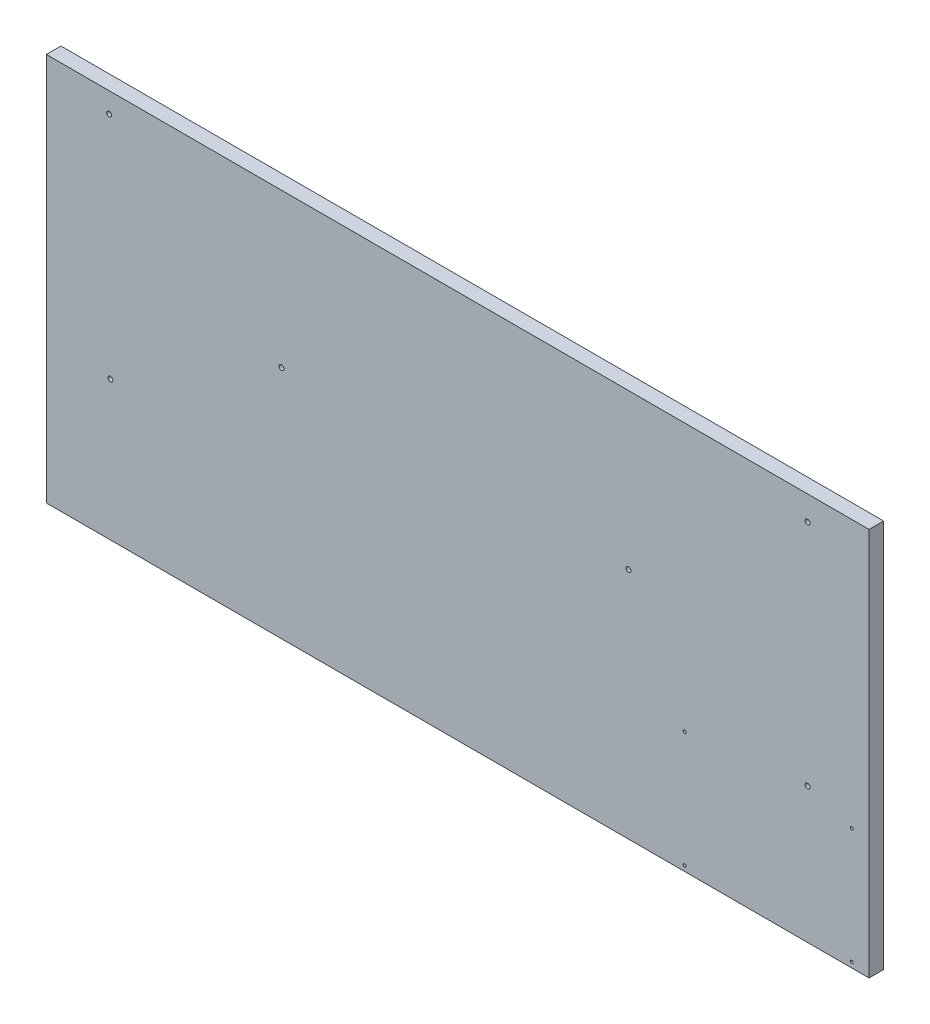
ISO-10303-21;
HEADER;
FILE_DESCRIPTION(('STEP AP214'),'2;1');
FILE_NAME('part.step','',(''),(''),'','','');
FILE_SCHEMA(('AUTOMOTIVE_DESIGN { 1 0 10303 214 1 1 1 1 }'));
ENDSEC;
DATA;
#1=APPLICATION_CONTEXT('core data for automotive mechanical design processes');
#2=APPLICATION_PROTOCOL_DEFINITION('international standard','automotive_design',2000,#1);
#3=PRODUCT_CONTEXT('',#1,'mechanical');
#4=PRODUCT('Part','Part','',(#3));
#5=PRODUCT_RELATED_PRODUCT_CATEGORY('part','',(#4));
#6=PRODUCT_DEFINITION_FORMATION('','',#4);
#7=PRODUCT_DEFINITION_CONTEXT('part definition',#1,'design');
#8=PRODUCT_DEFINITION('design','',#6,#7);
#9=PRODUCT_DEFINITION_SHAPE('','',#8);
#10=(LENGTH_UNIT() NAMED_UNIT(*) SI_UNIT(.MILLI.,.METRE.));
#11=(NAMED_UNIT(*) PLANE_ANGLE_UNIT() SI_UNIT($,.RADIAN.));
#12=(NAMED_UNIT(*) SI_UNIT($,.STERADIAN.) SOLID_ANGLE_UNIT());
#13=UNCERTAINTY_MEASURE_WITH_UNIT(LENGTH_MEASURE(1.E-05),#10,'distance_accuracy_value','');
#14=(GEOMETRIC_REPRESENTATION_CONTEXT(3) GLOBAL_UNCERTAINTY_ASSIGNED_CONTEXT((#13)) GLOBAL_UNIT_ASSIGNED_CONTEXT((#10,
#11,#12)) REPRESENTATION_CONTEXT('',''));
#15=CARTESIAN_POINT('',(0.,0.,0.));
#16=DIRECTION('',(0.,0.,1.));
#17=DIRECTION('',(1.,0.,0.));
#18=AXIS2_PLACEMENT_3D('',#15,#16,#17);
#19=CARTESIAN_POINT('',(-422.5,-199.5,15.));
#20=DIRECTION('',(1.,0.,0.));
#21=DIRECTION('',(0.,0.,-1.));
#22=AXIS2_PLACEMENT_3D('',#19,#20,#21);
#23=PLANE('',#22);
#24=DIRECTION('',(0.,-1.,0.));
#25=VECTOR('',#24,1.);
#26=CARTESIAN_POINT('',(-422.5,-199.5,0.));
#27=LINE('',#26,#25);
#28=CARTESIAN_POINT('',(-422.5,199.5,0.));
#29=VERTEX_POINT('',#28);
#30=CARTESIAN_POINT('',(-422.5,-199.5,0.));
#31=VERTEX_POINT('',#30);
#32=EDGE_CURVE('E112',#29,#31,#27,.T.);
#33=ORIENTED_EDGE('',*,*,#32,.T.);
#34=DIRECTION('',(0.,0.,-1.));
#35=VECTOR('',#34,1.);
#36=CARTESIAN_POINT('',(-422.5,-199.5,15.));
#37=LINE('',#36,#35);
#38=CARTESIAN_POINT('',(-422.5,-199.5,15.));
#39=VERTEX_POINT('',#38);
#40=EDGE_CURVE('E11',#39,#31,#37,.T.);
#41=ORIENTED_EDGE('',*,*,#40,.F.);
#42=DIRECTION('',(0.,-1.,0.));
#43=VECTOR('',#42,1.);
#44=CARTESIAN_POINT('',(-422.5,-199.5,15.));
#45=LINE('',#44,#43);
#46=CARTESIAN_POINT('',(-422.5,199.5,15.));
#47=VERTEX_POINT('',#46);
#48=EDGE_CURVE('E96',#47,#39,#45,.T.);
#49=ORIENTED_EDGE('',*,*,#48,.F.);
#50=DIRECTION('',(0.,0.,-1.));
#51=VECTOR('',#50,1.);
#52=CARTESIAN_POINT('',(-422.5,199.5,15.));
#53=LINE('',#52,#51);
#54=EDGE_CURVE('E108',#47,#29,#53,.T.);
#55=ORIENTED_EDGE('',*,*,#54,.T.);
#56=EDGE_LOOP('',(#33,#41,#49,#55));
#57=FACE_BOUND('',#56,.T.);
#58=ADVANCED_FACE('F44',(#57),#23,.F.);
#59=CARTESIAN_POINT('',(422.5,-199.5,15.));
#60=DIRECTION('',(0.,1.,0.));
#61=DIRECTION('',(-1.,0.,0.));
#62=AXIS2_PLACEMENT_3D('',#59,#60,#61);
#63=PLANE('',#62);
#64=DIRECTION('',(1.,0.,0.));
#65=VECTOR('',#64,1.);
#66=CARTESIAN_POINT('',(422.5,-199.5,0.));
#67=LINE('',#66,#65);
#68=CARTESIAN_POINT('',(422.5,-199.5,0.));
#69=VERTEX_POINT('',#68);
#70=EDGE_CURVE('E101',#31,#69,#67,.T.);
#71=ORIENTED_EDGE('',*,*,#70,.T.);
#72=DIRECTION('',(0.,0.,-1.));
#73=VECTOR('',#72,1.);
#74=CARTESIAN_POINT('',(422.5,-199.5,15.));
#75=LINE('',#74,#73);
#76=CARTESIAN_POINT('',(422.5,-199.5,15.));
#77=VERTEX_POINT('',#76);
#78=EDGE_CURVE('E53',#77,#69,#75,.T.);
#79=ORIENTED_EDGE('',*,*,#78,.F.);
#80=DIRECTION('',(1.,0.,0.));
#81=VECTOR('',#80,1.);
#82=CARTESIAN_POINT('',(422.5,-199.5,15.));
#83=LINE('',#82,#81);
#84=EDGE_CURVE('E91',#39,#77,#83,.T.);
#85=ORIENTED_EDGE('',*,*,#84,.F.);
#86=ORIENTED_EDGE('',*,*,#40,.T.);
#87=EDGE_LOOP('',(#71,#79,#85,#86));
#88=FACE_BOUND('',#87,.T.);
#89=ADVANCED_FACE('F100',(#88),#63,.F.);
#90=CARTESIAN_POINT('',(422.5,-199.5,15.));
#91=DIRECTION('',(-1.,0.,0.));
#92=DIRECTION('',(0.,0.,1.));
#93=AXIS2_PLACEMENT_3D('',#90,#91,#92);
#94=PLANE('',#93);
#95=DIRECTION('',(0.,1.,0.));
#96=VECTOR('',#95,1.);
#97=CARTESIAN_POINT('',(422.5,-199.5,0.));
#98=LINE('',#97,#96);
#99=CARTESIAN_POINT('',(422.5,199.5,0.));
#100=VERTEX_POINT('',#99);
#101=EDGE_CURVE('E78',#69,#100,#98,.T.);
#102=ORIENTED_EDGE('',*,*,#101,.T.);
#103=DIRECTION('',(0.,0.,-1.));
#104=VECTOR('',#103,1.);
#105=CARTESIAN_POINT('',(422.5,199.5,15.));
#106=LINE('',#105,#104);
#107=CARTESIAN_POINT('',(422.5,199.5,15.));
#108=VERTEX_POINT('',#107);
#109=EDGE_CURVE('E103',#108,#100,#106,.T.);
#110=ORIENTED_EDGE('',*,*,#109,.F.);
#111=DIRECTION('',(0.,1.,0.));
#112=VECTOR('',#111,1.);
#113=CARTESIAN_POINT('',(422.5,-199.5,15.));
#114=LINE('',#113,#112);
#115=EDGE_CURVE('E94',#77,#108,#114,.T.);
#116=ORIENTED_EDGE('',*,*,#115,.F.);
#117=ORIENTED_EDGE('',*,*,#78,.T.);
#118=EDGE_LOOP('',(#102,#110,#116,#117));
#119=FACE_BOUND('',#118,.T.);
#120=ADVANCED_FACE('F104',(#119),#94,.F.);
#121=CARTESIAN_POINT('',(422.5,199.5,15.));
#122=DIRECTION('',(0.,-1.,0.));
#123=DIRECTION('',(1.,0.,0.));
#124=AXIS2_PLACEMENT_3D('',#121,#122,#123);
#125=PLANE('',#124);
#126=DIRECTION('',(-1.,0.,0.));
#127=VECTOR('',#126,1.);
#128=CARTESIAN_POINT('',(422.5,199.5,0.));
#129=LINE('',#128,#127);
#130=EDGE_CURVE('E84',#100,#29,#129,.T.);
#131=ORIENTED_EDGE('',*,*,#130,.T.);
#132=ORIENTED_EDGE('',*,*,#54,.F.);
#133=DIRECTION('',(-1.,0.,0.));
#134=VECTOR('',#133,1.);
#135=CARTESIAN_POINT('',(422.5,199.5,15.));
#136=LINE('',#135,#134);
#137=EDGE_CURVE('E61',#108,#47,#136,.T.);
#138=ORIENTED_EDGE('',*,*,#137,.F.);
#139=ORIENTED_EDGE('',*,*,#109,.T.);
#140=EDGE_LOOP('',(#131,#132,#138,#139));
#141=FACE_BOUND('',#140,.T.);
#142=ADVANCED_FACE('F126',(#141),#125,.F.);
#143=CARTESIAN_POINT('',(0.,0.,15.));
#144=DIRECTION('',(0.,0.,1.));
#145=DIRECTION('',(1.,0.,0.));
#146=AXIS2_PLACEMENT_3D('',#143,#144,#145);
#147=PLANE('',#146);
#148=CARTESIAN_POINT('',(233.,-194.1,15.));
#149=DIRECTION('',(0.,0.,1.));
#150=DIRECTION('',(1.,0.,0.));
#151=AXIS2_PLACEMENT_3D('',#148,#149,#150);
#152=CIRCLE('',#151,1.5);
#153=CARTESIAN_POINT('',(234.5,-194.1,15.));
#154=VERTEX_POINT('',#153);
#155=EDGE_CURVE('E205',#154,#154,#152,.T.);
#156=ORIENTED_EDGE('',*,*,#155,.F.);
#157=EDGE_LOOP('',(#156));
#158=FACE_BOUND('',#157,.T.);
#159=CARTESIAN_POINT('',(404.7,-194.1,15.));
#160=DIRECTION('',(0.,0.,1.));
#161=DIRECTION('',(1.,0.,0.));
#162=AXIS2_PLACEMENT_3D('',#159,#160,#161);
#163=CIRCLE('',#162,1.50000000000002);
#164=CARTESIAN_POINT('',(406.2,-194.1,15.));
#165=VERTEX_POINT('',#164);
#166=EDGE_CURVE('E201',#165,#165,#163,.T.);
#167=ORIENTED_EDGE('',*,*,#166,.F.);
#168=EDGE_LOOP('',(#167));
#169=FACE_BOUND('',#168,.T.);
#170=CARTESIAN_POINT('',(233.,-75.1,15.));
#171=DIRECTION('',(0.,0.,1.));
#172=DIRECTION('',(1.,0.,0.));
#173=AXIS2_PLACEMENT_3D('',#170,#171,#172);
#174=CIRCLE('',#173,1.5);
#175=CARTESIAN_POINT('',(234.5,-75.1,15.));
#176=VERTEX_POINT('',#175);
#177=EDGE_CURVE('E190',#176,#176,#174,.T.);
#178=ORIENTED_EDGE('',*,*,#177,.F.);
#179=EDGE_LOOP('',(#178));
#180=FACE_BOUND('',#179,.T.);
#181=CARTESIAN_POINT('',(404.7,-75.1,15.));
#182=DIRECTION('',(0.,0.,1.));
#183=DIRECTION('',(1.,0.,0.));
#184=AXIS2_PLACEMENT_3D('',#181,#182,#183);
#185=CIRCLE('',#184,1.50000000000002);
#186=CARTESIAN_POINT('',(406.2,-75.1,15.));
#187=VERTEX_POINT('',#186);
#188=EDGE_CURVE('E185',#187,#187,#185,.T.);
#189=ORIENTED_EDGE('',*,*,#188,.F.);
#190=EDGE_LOOP('',(#189));
#191=FACE_BOUND('',#190,.T.);
#192=CARTESIAN_POINT('',(-356.7,-56.3,15.));
#193=DIRECTION('',(0.,0.,1.));
#194=DIRECTION('',(1.,0.,0.));
#195=AXIS2_PLACEMENT_3D('',#192,#193,#194);
#196=CIRCLE('',#195,2.50000000000002);
#197=CARTESIAN_POINT('',(-354.2,-56.3,15.));
#198=VERTEX_POINT('',#197);
#199=EDGE_CURVE('E137',#198,#198,#196,.T.);
#200=ORIENTED_EDGE('',*,*,#199,.F.);
#201=EDGE_LOOP('',(#200));
#202=FACE_BOUND('',#201,.T.);
#203=CARTESIAN_POINT('',(-181.,41.7,15.));
#204=DIRECTION('',(0.,0.,1.));
#205=DIRECTION('',(1.,0.,0.));
#206=AXIS2_PLACEMENT_3D('',#203,#204,#205);
#207=CIRCLE('',#206,2.5);
#208=CARTESIAN_POINT('',(-178.5,41.7,15.));
#209=VERTEX_POINT('',#208);
#210=EDGE_CURVE('E162',#209,#209,#207,.T.);
#211=ORIENTED_EDGE('',*,*,#210,.F.);
#212=EDGE_LOOP('',(#211));
#213=FACE_BOUND('',#212,.T.);
#214=CARTESIAN_POINT('',(359.4,-60.3,15.));
#215=DIRECTION('',(0.,0.,1.));
#216=DIRECTION('',(1.,0.,0.));
#217=AXIS2_PLACEMENT_3D('',#214,#215,#216);
#218=CIRCLE('',#217,2.50000000000002);
#219=CARTESIAN_POINT('',(361.9,-60.3,15.));
#220=VERTEX_POINT('',#219);
#221=EDGE_CURVE('E154',#220,#220,#218,.T.);
#222=ORIENTED_EDGE('',*,*,#221,.F.);
#223=EDGE_LOOP('',(#222));
#224=FACE_BOUND('',#223,.T.);
#225=CARTESIAN_POINT('',(359.4,174.5,15.));
#226=DIRECTION('',(0.,0.,1.));
#227=DIRECTION('',(1.,0.,0.));
#228=AXIS2_PLACEMENT_3D('',#225,#226,#227);
#229=CIRCLE('',#228,2.50000000000002);
#230=CARTESIAN_POINT('',(361.9,174.5,15.));
#231=VERTEX_POINT('',#230);
#232=EDGE_CURVE('E145',#231,#231,#229,.T.);
#233=ORIENTED_EDGE('',*,*,#232,.F.);
#234=EDGE_LOOP('',(#233));
#235=FACE_BOUND('',#234,.T.);
#236=CARTESIAN_POINT('',(175.4,40.3,15.));
#237=DIRECTION('',(0.,0.,1.));
#238=DIRECTION('',(1.,0.,0.));
#239=AXIS2_PLACEMENT_3D('',#236,#237,#238);
#240=CIRCLE('',#239,2.5);
#241=CARTESIAN_POINT('',(177.9,40.3,15.));
#242=VERTEX_POINT('',#241);
#243=EDGE_CURVE('E146',#242,#242,#240,.T.);
#244=ORIENTED_EDGE('',*,*,#243,.F.);
#245=EDGE_LOOP('',(#244));
#246=FACE_BOUND('',#245,.T.);
#247=CARTESIAN_POINT('',(-358.,178.7,15.));
#248=DIRECTION('',(0.,0.,1.));
#249=DIRECTION('',(1.,0.,0.));
#250=AXIS2_PLACEMENT_3D('',#247,#248,#249);
#251=CIRCLE('',#250,2.50000000000002);
#252=CARTESIAN_POINT('',(-355.5,178.7,15.));
#253=VERTEX_POINT('',#252);
#254=EDGE_CURVE('E133',#253,#253,#251,.T.);
#255=ORIENTED_EDGE('',*,*,#254,.F.);
#256=EDGE_LOOP('',(#255));
#257=FACE_BOUND('',#256,.T.);
#258=ORIENTED_EDGE('',*,*,#48,.T.);
#259=ORIENTED_EDGE('',*,*,#84,.T.);
#260=ORIENTED_EDGE('',*,*,#115,.T.);
#261=ORIENTED_EDGE('',*,*,#137,.T.);
#262=EDGE_LOOP('',(#258,#259,#260,#261));
#263=FACE_BOUND('',#262,.T.);
#264=ADVANCED_FACE('F92',(#158,#169,#180,#191,#202,#213,#224,#235,#246,#257,#263),#147,.T.);
#265=CARTESIAN_POINT('',(0.,0.,0.));
#266=DIRECTION('',(0.,0.,1.));
#267=DIRECTION('',(1.,0.,0.));
#268=AXIS2_PLACEMENT_3D('',#265,#266,#267);
#269=PLANE('',#268);
#270=CARTESIAN_POINT('',(233.,-194.1,0.));
#271=DIRECTION('',(0.,0.,1.));
#272=DIRECTION('',(1.,0.,0.));
#273=AXIS2_PLACEMENT_3D('',#270,#271,#272);
#274=CIRCLE('',#273,1.5);
#275=CARTESIAN_POINT('',(234.5,-194.1,0.));
#276=VERTEX_POINT('',#275);
#277=EDGE_CURVE('E186',#276,#276,#274,.T.);
#278=ORIENTED_EDGE('',*,*,#277,.T.);
#279=EDGE_LOOP('',(#278));
#280=FACE_BOUND('',#279,.T.);
#281=CARTESIAN_POINT('',(404.7,-194.1,0.));
#282=DIRECTION('',(0.,0.,1.));
#283=DIRECTION('',(1.,0.,0.));
#284=AXIS2_PLACEMENT_3D('',#281,#282,#283);
#285=CIRCLE('',#284,1.50000000000002);
#286=CARTESIAN_POINT('',(406.2,-194.1,0.));
#287=VERTEX_POINT('',#286);
#288=EDGE_CURVE('E197',#287,#287,#285,.T.);
#289=ORIENTED_EDGE('',*,*,#288,.T.);
#290=EDGE_LOOP('',(#289));
#291=FACE_BOUND('',#290,.T.);
#292=ORIENTED_EDGE('',*,*,#32,.F.);
#293=ORIENTED_EDGE('',*,*,#130,.F.);
#294=ORIENTED_EDGE('',*,*,#101,.F.);
#295=ORIENTED_EDGE('',*,*,#70,.F.);
#296=EDGE_LOOP('',(#292,#293,#294,#295));
#297=FACE_BOUND('',#296,.T.);
#298=ADVANCED_FACE('F129',(#280,#291,#297),#269,.F.);
#299=CARTESIAN_POINT('',(-358.,178.7,5.));
#300=DIRECTION('',(0.,0.,1.));
#301=DIRECTION('',(1.,0.,0.));
#302=AXIS2_PLACEMENT_3D('',#299,#300,#301);
#303=CYLINDRICAL_SURFACE('',#302,2.50000000000002);
#304=CARTESIAN_POINT('',(-358.,178.7,5.));
#305=DIRECTION('',(0.,0.,1.));
#306=DIRECTION('',(1.,0.,0.));
#307=AXIS2_PLACEMENT_3D('',#304,#305,#306);
#308=CIRCLE('',#307,2.50000000000002);
#309=CARTESIAN_POINT('',(-355.5,178.7,5.));
#310=VERTEX_POINT('',#309);
#311=EDGE_CURVE('E116',#310,#310,#308,.T.);
#312=ORIENTED_EDGE('',*,*,#311,.F.);
#313=EDGE_LOOP('',(#312));
#314=FACE_BOUND('',#313,.T.);
#315=ORIENTED_EDGE('',*,*,#254,.T.);
#316=EDGE_LOOP('',(#315));
#317=FACE_BOUND('',#316,.T.);
#318=ADVANCED_FACE('F243',(#314,#317),#303,.F.);
#319=CARTESIAN_POINT('',(-358.,178.7,5.));
#320=DIRECTION('',(0.,0.,1.));
#321=DIRECTION('',(1.,0.,0.));
#322=AXIS2_PLACEMENT_3D('',#319,#320,#321);
#323=PLANE('',#322);
#324=ORIENTED_EDGE('',*,*,#311,.T.);
#325=EDGE_LOOP('',(#324));
#326=FACE_BOUND('',#325,.T.);
#327=ADVANCED_FACE('F245',(#326),#323,.T.);
#328=CARTESIAN_POINT('',(175.4,40.3,5.));
#329=DIRECTION('',(0.,0.,1.));
#330=DIRECTION('',(1.,0.,0.));
#331=AXIS2_PLACEMENT_3D('',#328,#329,#330);
#332=CYLINDRICAL_SURFACE('',#331,2.5);
#333=CARTESIAN_POINT('',(175.4,40.3,5.));
#334=DIRECTION('',(0.,0.,1.));
#335=DIRECTION('',(1.,0.,0.));
#336=AXIS2_PLACEMENT_3D('',#333,#334,#335);
#337=CIRCLE('',#336,2.5);
#338=CARTESIAN_POINT('',(177.9,40.3,5.));
#339=VERTEX_POINT('',#338);
#340=EDGE_CURVE('E173',#339,#339,#337,.T.);
#341=ORIENTED_EDGE('',*,*,#340,.F.);
#342=EDGE_LOOP('',(#341));
#343=FACE_BOUND('',#342,.T.);
#344=ORIENTED_EDGE('',*,*,#243,.T.);
#345=EDGE_LOOP('',(#344));
#346=FACE_BOUND('',#345,.T.);
#347=ADVANCED_FACE('F252',(#343,#346),#332,.F.);
#348=CARTESIAN_POINT('',(175.4,40.3,5.));
#349=DIRECTION('',(0.,0.,1.));
#350=DIRECTION('',(1.,0.,0.));
#351=AXIS2_PLACEMENT_3D('',#348,#349,#350);
#352=PLANE('',#351);
#353=ORIENTED_EDGE('',*,*,#340,.T.);
#354=EDGE_LOOP('',(#353));
#355=FACE_BOUND('',#354,.T.);
#356=ADVANCED_FACE('F311',(#355),#352,.T.);
#357=CARTESIAN_POINT('',(359.4,174.5,5.));
#358=DIRECTION('',(0.,0.,1.));
#359=DIRECTION('',(1.,0.,0.));
#360=AXIS2_PLACEMENT_3D('',#357,#358,#359);
#361=CYLINDRICAL_SURFACE('',#360,2.50000000000002);
#362=CARTESIAN_POINT('',(359.4,174.5,5.));
#363=DIRECTION('',(0.,0.,1.));
#364=DIRECTION('',(1.,0.,0.));
#365=AXIS2_PLACEMENT_3D('',#362,#363,#364);
#366=CIRCLE('',#365,2.50000000000002);
#367=CARTESIAN_POINT('',(361.9,174.5,5.));
#368=VERTEX_POINT('',#367);
#369=EDGE_CURVE('E141',#368,#368,#366,.T.);
#370=ORIENTED_EDGE('',*,*,#369,.F.);
#371=EDGE_LOOP('',(#370));
#372=FACE_BOUND('',#371,.T.);
#373=ORIENTED_EDGE('',*,*,#232,.T.);
#374=EDGE_LOOP('',(#373));
#375=FACE_BOUND('',#374,.T.);
#376=ADVANCED_FACE('F320',(#372,#375),#361,.F.);
#377=CARTESIAN_POINT('',(359.4,174.5,5.));
#378=DIRECTION('',(0.,0.,1.));
#379=DIRECTION('',(1.,0.,0.));
#380=AXIS2_PLACEMENT_3D('',#377,#378,#379);
#381=PLANE('',#380);
#382=ORIENTED_EDGE('',*,*,#369,.T.);
#383=EDGE_LOOP('',(#382));
#384=FACE_BOUND('',#383,.T.);
#385=ADVANCED_FACE('F329',(#384),#381,.T.);
#386=CARTESIAN_POINT('',(359.4,-60.3,5.));
#387=DIRECTION('',(0.,0.,1.));
#388=DIRECTION('',(1.,0.,0.));
#389=AXIS2_PLACEMENT_3D('',#386,#387,#388);
#390=CYLINDRICAL_SURFACE('',#389,2.50000000000002);
#391=CARTESIAN_POINT('',(359.4,-60.3,5.));
#392=DIRECTION('',(0.,0.,1.));
#393=DIRECTION('',(1.,0.,0.));
#394=AXIS2_PLACEMENT_3D('',#391,#392,#393);
#395=CIRCLE('',#394,2.50000000000002);
#396=CARTESIAN_POINT('',(361.9,-60.3,5.));
#397=VERTEX_POINT('',#396);
#398=EDGE_CURVE('E150',#397,#397,#395,.T.);
#399=ORIENTED_EDGE('',*,*,#398,.F.);
#400=EDGE_LOOP('',(#399));
#401=FACE_BOUND('',#400,.T.);
#402=ORIENTED_EDGE('',*,*,#221,.T.);
#403=EDGE_LOOP('',(#402));
#404=FACE_BOUND('',#403,.T.);
#405=ADVANCED_FACE('F338',(#401,#404),#390,.F.);
#406=CARTESIAN_POINT('',(359.4,-60.3,5.));
#407=DIRECTION('',(0.,0.,1.));
#408=DIRECTION('',(1.,0.,0.));
#409=AXIS2_PLACEMENT_3D('',#406,#407,#408);
#410=PLANE('',#409);
#411=ORIENTED_EDGE('',*,*,#398,.T.);
#412=EDGE_LOOP('',(#411));
#413=FACE_BOUND('',#412,.T.);
#414=ADVANCED_FACE('F347',(#413),#410,.T.);
#415=CARTESIAN_POINT('',(-181.,41.7,5.));
#416=DIRECTION('',(0.,0.,1.));
#417=DIRECTION('',(1.,0.,0.));
#418=AXIS2_PLACEMENT_3D('',#415,#416,#417);
#419=CYLINDRICAL_SURFACE('',#418,2.5);
#420=CARTESIAN_POINT('',(-181.,41.7,5.));
#421=DIRECTION('',(0.,0.,1.));
#422=DIRECTION('',(1.,0.,0.));
#423=AXIS2_PLACEMENT_3D('',#420,#421,#422);
#424=CIRCLE('',#423,2.5);
#425=CARTESIAN_POINT('',(-178.5,41.7,5.));
#426=VERTEX_POINT('',#425);
#427=EDGE_CURVE('E158',#426,#426,#424,.T.);
#428=ORIENTED_EDGE('',*,*,#427,.F.);
#429=EDGE_LOOP('',(#428));
#430=FACE_BOUND('',#429,.T.);
#431=ORIENTED_EDGE('',*,*,#210,.T.);
#432=EDGE_LOOP('',(#431));
#433=FACE_BOUND('',#432,.T.);
#434=ADVANCED_FACE('F356',(#430,#433),#419,.F.);
#435=CARTESIAN_POINT('',(-181.,41.7,5.));
#436=DIRECTION('',(0.,0.,1.));
#437=DIRECTION('',(1.,0.,0.));
#438=AXIS2_PLACEMENT_3D('',#435,#436,#437);
#439=PLANE('',#438);
#440=ORIENTED_EDGE('',*,*,#427,.T.);
#441=EDGE_LOOP('',(#440));
#442=FACE_BOUND('',#441,.T.);
#443=ADVANCED_FACE('F365',(#442),#439,.T.);
#444=CARTESIAN_POINT('',(-356.7,-56.3,5.));
#445=DIRECTION('',(0.,0.,1.));
#446=DIRECTION('',(1.,0.,0.));
#447=AXIS2_PLACEMENT_3D('',#444,#445,#446);
#448=CYLINDRICAL_SURFACE('',#447,2.50000000000002);
#449=CARTESIAN_POINT('',(-356.7,-56.3,5.));
#450=DIRECTION('',(0.,0.,1.));
#451=DIRECTION('',(1.,0.,0.));
#452=AXIS2_PLACEMENT_3D('',#449,#450,#451);
#453=CIRCLE('',#452,2.50000000000002);
#454=CARTESIAN_POINT('',(-354.2,-56.3,5.));
#455=VERTEX_POINT('',#454);
#456=EDGE_CURVE('E166',#455,#455,#453,.T.);
#457=ORIENTED_EDGE('',*,*,#456,.F.);
#458=EDGE_LOOP('',(#457));
#459=FACE_BOUND('',#458,.T.);
#460=ORIENTED_EDGE('',*,*,#199,.T.);
#461=EDGE_LOOP('',(#460));
#462=FACE_BOUND('',#461,.T.);
#463=ADVANCED_FACE('F374',(#459,#462),#448,.F.);
#464=CARTESIAN_POINT('',(-356.7,-56.3,5.));
#465=DIRECTION('',(0.,0.,1.));
#466=DIRECTION('',(1.,0.,0.));
#467=AXIS2_PLACEMENT_3D('',#464,#465,#466);
#468=PLANE('',#467);
#469=ORIENTED_EDGE('',*,*,#456,.T.);
#470=EDGE_LOOP('',(#469));
#471=FACE_BOUND('',#470,.T.);
#472=ADVANCED_FACE('F383',(#471),#468,.T.);
#473=CARTESIAN_POINT('',(404.7,-75.1,5.));
#474=DIRECTION('',(0.,0.,1.));
#475=DIRECTION('',(1.,0.,0.));
#476=AXIS2_PLACEMENT_3D('',#473,#474,#475);
#477=CYLINDRICAL_SURFACE('',#476,1.50000000000002);
#478=CARTESIAN_POINT('',(404.7,-75.1,5.));
#479=DIRECTION('',(0.,0.,1.));
#480=DIRECTION('',(1.,0.,0.));
#481=AXIS2_PLACEMENT_3D('',#478,#479,#480);
#482=CIRCLE('',#481,1.50000000000002);
#483=CARTESIAN_POINT('',(406.2,-75.1,5.));
#484=VERTEX_POINT('',#483);
#485=EDGE_CURVE('E181',#484,#484,#482,.T.);
#486=ORIENTED_EDGE('',*,*,#485,.F.);
#487=EDGE_LOOP('',(#486));
#488=FACE_BOUND('',#487,.T.);
#489=ORIENTED_EDGE('',*,*,#188,.T.);
#490=EDGE_LOOP('',(#489));
#491=FACE_BOUND('',#490,.T.);
#492=ADVANCED_FACE('F392',(#488,#491),#477,.F.);
#493=CARTESIAN_POINT('',(404.7,-75.1,5.));
#494=DIRECTION('',(0.,0.,1.));
#495=DIRECTION('',(1.,0.,0.));
#496=AXIS2_PLACEMENT_3D('',#493,#494,#495);
#497=PLANE('',#496);
#498=ORIENTED_EDGE('',*,*,#485,.T.);
#499=EDGE_LOOP('',(#498));
#500=FACE_BOUND('',#499,.T.);
#501=ADVANCED_FACE('F401',(#500),#497,.T.);
#502=CARTESIAN_POINT('',(233.,-75.1,5.));
#503=DIRECTION('',(0.,0.,1.));
#504=DIRECTION('',(1.,0.,0.));
#505=AXIS2_PLACEMENT_3D('',#502,#503,#504);
#506=CYLINDRICAL_SURFACE('',#505,1.5);
#507=CARTESIAN_POINT('',(233.,-75.1,5.));
#508=DIRECTION('',(0.,0.,1.));
#509=DIRECTION('',(1.,0.,0.));
#510=AXIS2_PLACEMENT_3D('',#507,#508,#509);
#511=CIRCLE('',#510,1.5);
#512=CARTESIAN_POINT('',(234.5,-75.1,5.));
#513=VERTEX_POINT('',#512);
#514=EDGE_CURVE('E177',#513,#513,#511,.T.);
#515=ORIENTED_EDGE('',*,*,#514,.F.);
#516=EDGE_LOOP('',(#515));
#517=FACE_BOUND('',#516,.T.);
#518=ORIENTED_EDGE('',*,*,#177,.T.);
#519=EDGE_LOOP('',(#518));
#520=FACE_BOUND('',#519,.T.);
#521=ADVANCED_FACE('F410',(#517,#520),#506,.F.);
#522=CARTESIAN_POINT('',(233.,-75.1,5.));
#523=DIRECTION('',(0.,0.,1.));
#524=DIRECTION('',(1.,0.,0.));
#525=AXIS2_PLACEMENT_3D('',#522,#523,#524);
#526=PLANE('',#525);
#527=ORIENTED_EDGE('',*,*,#514,.T.);
#528=EDGE_LOOP('',(#527));
#529=FACE_BOUND('',#528,.T.);
#530=ADVANCED_FACE('F419',(#529),#526,.T.);
#531=CARTESIAN_POINT('',(404.7,-194.1,0.));
#532=DIRECTION('',(0.,0.,1.));
#533=DIRECTION('',(1.,0.,0.));
#534=AXIS2_PLACEMENT_3D('',#531,#532,#533);
#535=CYLINDRICAL_SURFACE('',#534,1.50000000000002);
#536=ORIENTED_EDGE('',*,*,#288,.F.);
#537=EDGE_LOOP('',(#536));
#538=FACE_BOUND('',#537,.T.);
#539=ORIENTED_EDGE('',*,*,#166,.T.);
#540=EDGE_LOOP('',(#539));
#541=FACE_BOUND('',#540,.T.);
#542=ADVANCED_FACE('F218',(#538,#541),#535,.F.);
#543=CARTESIAN_POINT('',(233.,-194.1,0.));
#544=DIRECTION('',(0.,0.,1.));
#545=DIRECTION('',(1.,0.,0.));
#546=AXIS2_PLACEMENT_3D('',#543,#544,#545);
#547=CYLINDRICAL_SURFACE('',#546,1.5);
#548=ORIENTED_EDGE('',*,*,#277,.F.);
#549=EDGE_LOOP('',(#548));
#550=FACE_BOUND('',#549,.T.);
#551=ORIENTED_EDGE('',*,*,#155,.T.);
#552=EDGE_LOOP('',(#551));
#553=FACE_BOUND('',#552,.T.);
#554=ADVANCED_FACE('F215',(#550,#553),#547,.F.);
#555=CLOSED_SHELL('',(#58,#89,#120,#142,#264,#298,#318,#327,#347,#356,#376,#385,#405,#414,#434,
#443,#463,#472,#492,#501,#521,#530,#542,#554));
#556=MANIFOLD_SOLID_BREP('B2',#555);
#557=ADVANCED_BREP_SHAPE_REPRESENTATION('',(#18,#556),#14);
#558=SHAPE_DEFINITION_REPRESENTATION(#9,#557);
ENDSEC;
END-ISO-10303-21;
